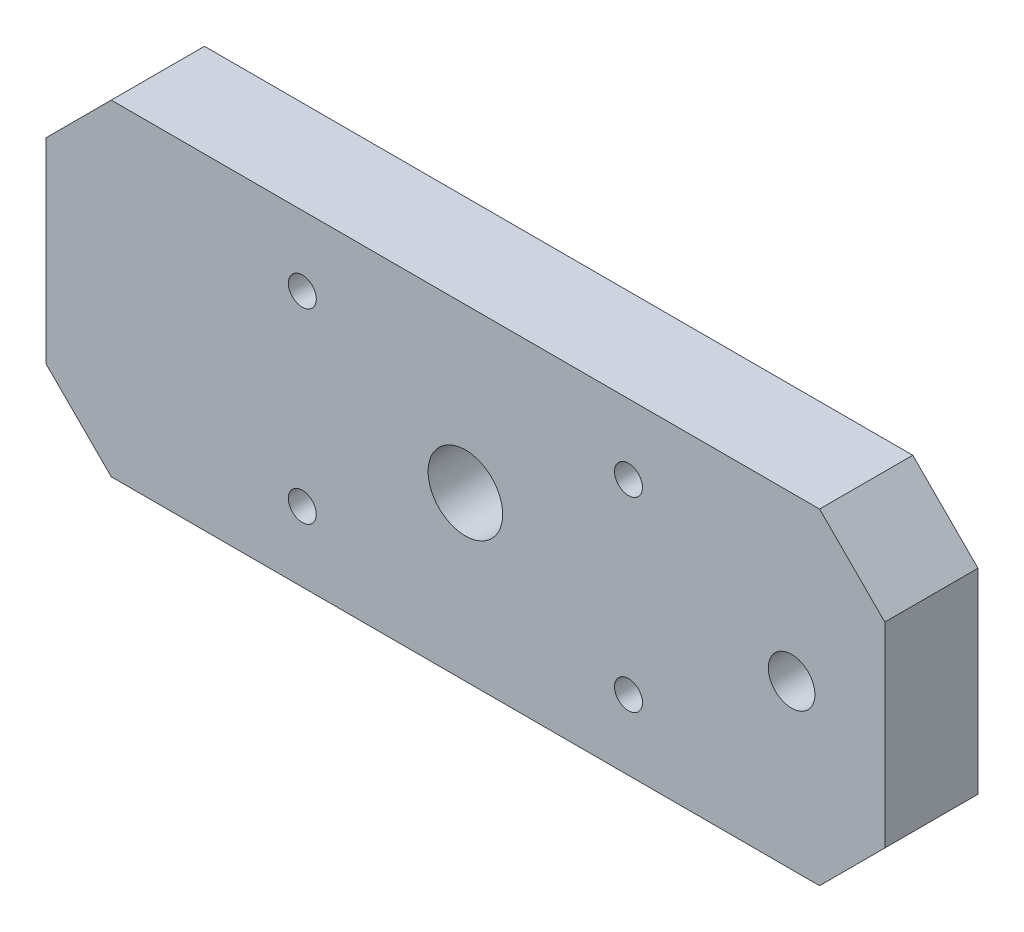
ISO-10303-21;
HEADER;
FILE_DESCRIPTION(('STEP AP214'),'2;1');
FILE_NAME('part.step','',(''),(''),'','','');
FILE_SCHEMA(('AUTOMOTIVE_DESIGN { 1 0 10303 214 1 1 1 1 }'));
ENDSEC;
DATA;
#1=APPLICATION_CONTEXT('core data for automotive mechanical design processes');
#2=APPLICATION_PROTOCOL_DEFINITION('international standard','automotive_design',2000,#1);
#3=PRODUCT_CONTEXT('',#1,'mechanical');
#4=PRODUCT('Part','Part','',(#3));
#5=PRODUCT_RELATED_PRODUCT_CATEGORY('part','',(#4));
#6=PRODUCT_DEFINITION_FORMATION('','',#4);
#7=PRODUCT_DEFINITION_CONTEXT('part definition',#1,'design');
#8=PRODUCT_DEFINITION('design','',#6,#7);
#9=PRODUCT_DEFINITION_SHAPE('','',#8);
#10=(LENGTH_UNIT() NAMED_UNIT(*) SI_UNIT(.MILLI.,.METRE.));
#11=(NAMED_UNIT(*) PLANE_ANGLE_UNIT() SI_UNIT($,.RADIAN.));
#12=(NAMED_UNIT(*) SI_UNIT($,.STERADIAN.) SOLID_ANGLE_UNIT());
#13=UNCERTAINTY_MEASURE_WITH_UNIT(LENGTH_MEASURE(1.E-05),#10,'distance_accuracy_value','');
#14=(GEOMETRIC_REPRESENTATION_CONTEXT(3) GLOBAL_UNCERTAINTY_ASSIGNED_CONTEXT((#13)) GLOBAL_UNIT_ASSIGNED_CONTEXT((#10,
#11,#12)) REPRESENTATION_CONTEXT('',''));
#15=CARTESIAN_POINT('',(0.,0.,0.));
#16=DIRECTION('',(0.,0.,1.));
#17=DIRECTION('',(1.,0.,0.));
#18=AXIS2_PLACEMENT_3D('',#15,#16,#17);
#19=CARTESIAN_POINT('',(0.,0.,10.));
#20=DIRECTION('',(0.,0.,1.));
#21=DIRECTION('',(1.,0.,0.));
#22=AXIS2_PLACEMENT_3D('',#19,#20,#21);
#23=PLANE('',#22);
#24=CARTESIAN_POINT('',(-17.5,9.99999999999999,10.));
#25=DIRECTION('',(0.,0.,1.));
#26=DIRECTION('',(-1.,0.,0.));
#27=AXIS2_PLACEMENT_3D('',#24,#25,#26);
#28=CIRCLE('',#27,1.5);
#29=CARTESIAN_POINT('',(-19.,9.99999999999999,10.));
#30=VERTEX_POINT('',#29);
#31=EDGE_CURVE('E205',#30,#30,#28,.T.);
#32=ORIENTED_EDGE('',*,*,#31,.F.);
#33=EDGE_LOOP('',(#32));
#34=FACE_BOUND('',#33,.T.);
#35=CARTESIAN_POINT('',(17.5,9.99999999999999,10.));
#36=DIRECTION('',(0.,0.,1.));
#37=DIRECTION('',(1.,0.,0.));
#38=AXIS2_PLACEMENT_3D('',#35,#36,#37);
#39=CIRCLE('',#38,1.5);
#40=CARTESIAN_POINT('',(19.,9.99999999999999,10.));
#41=VERTEX_POINT('',#40);
#42=EDGE_CURVE('E193',#41,#41,#39,.T.);
#43=ORIENTED_EDGE('',*,*,#42,.F.);
#44=EDGE_LOOP('',(#43));
#45=FACE_BOUND('',#44,.T.);
#46=CARTESIAN_POINT('',(35.,0.,10.));
#47=DIRECTION('',(0.,0.,1.));
#48=DIRECTION('',(1.,0.,0.));
#49=AXIS2_PLACEMENT_3D('',#46,#47,#48);
#50=CIRCLE('',#49,2.5);
#51=CARTESIAN_POINT('',(37.5,0.,10.));
#52=VERTEX_POINT('',#51);
#53=EDGE_CURVE('E139',#52,#52,#50,.T.);
#54=ORIENTED_EDGE('',*,*,#53,.F.);
#55=EDGE_LOOP('',(#54));
#56=FACE_BOUND('',#55,.T.);
#57=DIRECTION('',(0.,-1.,0.));
#58=VECTOR('',#57,1.);
#59=CARTESIAN_POINT('',(-45.,17.5,10.));
#60=LINE('',#59,#58);
#61=CARTESIAN_POINT('',(-45.,10.5,10.));
#62=VERTEX_POINT('',#61);
#63=CARTESIAN_POINT('',(-45.,-10.5,10.));
#64=VERTEX_POINT('',#63);
#65=EDGE_CURVE('E144',#62,#64,#60,.T.);
#66=ORIENTED_EDGE('',*,*,#65,.T.);
#67=DIRECTION('',(-0.707106781186546,0.707106781186549,0.));
#68=VECTOR('',#67,1.);
#69=CARTESIAN_POINT('',(-27.7500000000001,-27.75,10.));
#70=LINE('',#69,#68);
#71=CARTESIAN_POINT('',(-38.,-17.5,10.));
#72=VERTEX_POINT('',#71);
#73=EDGE_CURVE('E159',#64,#72,#70,.F.);
#74=ORIENTED_EDGE('',*,*,#73,.T.);
#75=DIRECTION('',(1.,0.,0.));
#76=VECTOR('',#75,1.);
#77=CARTESIAN_POINT('',(-45.,-17.5,10.));
#78=LINE('',#77,#76);
#79=CARTESIAN_POINT('',(37.9999999999999,-17.5,10.));
#80=VERTEX_POINT('',#79);
#81=EDGE_CURVE('E126',#72,#80,#78,.T.);
#82=ORIENTED_EDGE('',*,*,#81,.T.);
#83=DIRECTION('',(-0.707106781186549,-0.707106781186546,0.));
#84=VECTOR('',#83,1.);
#85=CARTESIAN_POINT('',(27.7499999999999,-27.75,10.));
#86=LINE('',#85,#84);
#87=CARTESIAN_POINT('',(45.,-10.5,10.));
#88=VERTEX_POINT('',#87);
#89=EDGE_CURVE('E157',#80,#88,#86,.F.);
#90=ORIENTED_EDGE('',*,*,#89,.T.);
#91=DIRECTION('',(0.,1.,0.));
#92=VECTOR('',#91,1.);
#93=CARTESIAN_POINT('',(45.,17.5,10.));
#94=LINE('',#93,#92);
#95=CARTESIAN_POINT('',(45.,10.5,10.));
#96=VERTEX_POINT('',#95);
#97=EDGE_CURVE('E170',#88,#96,#94,.T.);
#98=ORIENTED_EDGE('',*,*,#97,.T.);
#99=DIRECTION('',(0.707106781186546,-0.707106781186549,0.));
#100=VECTOR('',#99,1.);
#101=CARTESIAN_POINT('',(27.7500000000001,27.75,10.));
#102=LINE('',#101,#100);
#103=CARTESIAN_POINT('',(38.,17.5,10.));
#104=VERTEX_POINT('',#103);
#105=EDGE_CURVE('E61',#96,#104,#102,.F.);
#106=ORIENTED_EDGE('',*,*,#105,.T.);
#107=DIRECTION('',(-1.,0.,0.));
#108=VECTOR('',#107,1.);
#109=CARTESIAN_POINT('',(-45.,17.5,10.));
#110=LINE('',#109,#108);
#111=CARTESIAN_POINT('',(-38.,17.5,10.));
#112=VERTEX_POINT('',#111);
#113=EDGE_CURVE('E145',#104,#112,#110,.T.);
#114=ORIENTED_EDGE('',*,*,#113,.T.);
#115=DIRECTION('',(0.707106781186549,0.707106781186546,0.));
#116=VECTOR('',#115,1.);
#117=CARTESIAN_POINT('',(-27.7499999999999,27.75,10.));
#118=LINE('',#117,#116);
#119=EDGE_CURVE('E154',#112,#62,#118,.F.);
#120=ORIENTED_EDGE('',*,*,#119,.T.);
#121=EDGE_LOOP('',(#66,#74,#82,#90,#98,#106,#114,#120));
#122=FACE_BOUND('',#121,.T.);
#123=CARTESIAN_POINT('',(0.,0.,10.));
#124=DIRECTION('',(0.,0.,1.));
#125=DIRECTION('',(1.,0.,0.));
#126=AXIS2_PLACEMENT_3D('',#123,#124,#125);
#127=CIRCLE('',#126,4.);
#128=CARTESIAN_POINT('',(4.,0.,10.));
#129=VERTEX_POINT('',#128);
#130=EDGE_CURVE('E187',#129,#129,#127,.T.);
#131=ORIENTED_EDGE('',*,*,#130,.F.);
#132=EDGE_LOOP('',(#131));
#133=FACE_BOUND('',#132,.T.);
#134=CARTESIAN_POINT('',(17.5,-10.,10.));
#135=DIRECTION('',(0.,0.,1.));
#136=DIRECTION('',(-1.,0.,0.));
#137=AXIS2_PLACEMENT_3D('',#134,#135,#136);
#138=CIRCLE('',#137,1.5);
#139=CARTESIAN_POINT('',(16.,-10.,10.));
#140=VERTEX_POINT('',#139);
#141=EDGE_CURVE('E199',#140,#140,#138,.T.);
#142=ORIENTED_EDGE('',*,*,#141,.F.);
#143=EDGE_LOOP('',(#142));
#144=FACE_BOUND('',#143,.T.);
#145=CARTESIAN_POINT('',(-17.5,-10.,10.));
#146=DIRECTION('',(0.,0.,1.));
#147=DIRECTION('',(1.,0.,0.));
#148=AXIS2_PLACEMENT_3D('',#145,#146,#147);
#149=CIRCLE('',#148,1.5);
#150=CARTESIAN_POINT('',(-16.,-10.,10.));
#151=VERTEX_POINT('',#150);
#152=EDGE_CURVE('E211',#151,#151,#149,.T.);
#153=ORIENTED_EDGE('',*,*,#152,.F.);
#154=EDGE_LOOP('',(#153));
#155=FACE_BOUND('',#154,.T.);
#156=ADVANCED_FACE('F39',(#34,#45,#56,#122,#133,#144,#155),#23,.T.);
#157=CARTESIAN_POINT('',(0.,0.,0.));
#158=DIRECTION('',(0.,0.,1.));
#159=DIRECTION('',(1.,0.,0.));
#160=AXIS2_PLACEMENT_3D('',#157,#158,#159);
#161=PLANE('',#160);
#162=DIRECTION('',(1.,0.,0.));
#163=VECTOR('',#162,1.);
#164=CARTESIAN_POINT('',(-45.,-17.5,0.));
#165=LINE('',#164,#163);
#166=CARTESIAN_POINT('',(-38.,-17.5,0.));
#167=VERTEX_POINT('',#166);
#168=CARTESIAN_POINT('',(37.9999999999999,-17.5,0.));
#169=VERTEX_POINT('',#168);
#170=EDGE_CURVE('E123',#167,#169,#165,.T.);
#171=ORIENTED_EDGE('',*,*,#170,.F.);
#172=DIRECTION('',(0.707106781186546,-0.707106781186549,0.));
#173=VECTOR('',#172,1.);
#174=CARTESIAN_POINT('',(-38.,-17.5,0.));
#175=LINE('',#174,#173);
#176=CARTESIAN_POINT('',(-45.,-10.5,0.));
#177=VERTEX_POINT('',#176);
#178=EDGE_CURVE('E106',#167,#177,#175,.F.);
#179=ORIENTED_EDGE('',*,*,#178,.T.);
#180=DIRECTION('',(0.,-1.,0.));
#181=VECTOR('',#180,1.);
#182=CARTESIAN_POINT('',(-45.,17.5,0.));
#183=LINE('',#182,#181);
#184=CARTESIAN_POINT('',(-45.,10.5,0.));
#185=VERTEX_POINT('',#184);
#186=EDGE_CURVE('E134',#185,#177,#183,.T.);
#187=ORIENTED_EDGE('',*,*,#186,.F.);
#188=DIRECTION('',(-0.707106781186549,-0.707106781186546,0.));
#189=VECTOR('',#188,1.);
#190=CARTESIAN_POINT('',(-45.,10.5,0.));
#191=LINE('',#190,#189);
#192=CARTESIAN_POINT('',(-38.,17.5,0.));
#193=VERTEX_POINT('',#192);
#194=EDGE_CURVE('E127',#185,#193,#191,.F.);
#195=ORIENTED_EDGE('',*,*,#194,.T.);
#196=DIRECTION('',(-1.,0.,0.));
#197=VECTOR('',#196,1.);
#198=CARTESIAN_POINT('',(-45.,17.5,0.));
#199=LINE('',#198,#197);
#200=CARTESIAN_POINT('',(38.,17.5,0.));
#201=VERTEX_POINT('',#200);
#202=EDGE_CURVE('E137',#201,#193,#199,.T.);
#203=ORIENTED_EDGE('',*,*,#202,.F.);
#204=DIRECTION('',(-0.707106781186546,0.707106781186549,0.));
#205=VECTOR('',#204,1.);
#206=CARTESIAN_POINT('',(38.,17.5,0.));
#207=LINE('',#206,#205);
#208=CARTESIAN_POINT('',(45.,10.5,0.));
#209=VERTEX_POINT('',#208);
#210=EDGE_CURVE('E148',#201,#209,#207,.F.);
#211=ORIENTED_EDGE('',*,*,#210,.T.);
#212=DIRECTION('',(0.,1.,0.));
#213=VECTOR('',#212,1.);
#214=CARTESIAN_POINT('',(45.,17.5,0.));
#215=LINE('',#214,#213);
#216=CARTESIAN_POINT('',(45.,-10.5,0.));
#217=VERTEX_POINT('',#216);
#218=EDGE_CURVE('E133',#217,#209,#215,.T.);
#219=ORIENTED_EDGE('',*,*,#218,.F.);
#220=DIRECTION('',(0.707106781186549,0.707106781186546,0.));
#221=VECTOR('',#220,1.);
#222=CARTESIAN_POINT('',(45.,-10.5,0.));
#223=LINE('',#222,#221);
#224=EDGE_CURVE('E117',#217,#169,#223,.F.);
#225=ORIENTED_EDGE('',*,*,#224,.T.);
#226=EDGE_LOOP('',(#171,#179,#187,#195,#203,#211,#219,#225));
#227=FACE_BOUND('',#226,.T.);
#228=CARTESIAN_POINT('',(35.,0.,0.));
#229=DIRECTION('',(0.,0.,1.));
#230=DIRECTION('',(1.,0.,0.));
#231=AXIS2_PLACEMENT_3D('',#228,#229,#230);
#232=CIRCLE('',#231,2.5);
#233=CARTESIAN_POINT('',(37.5,0.,0.));
#234=VERTEX_POINT('',#233);
#235=EDGE_CURVE('E184',#234,#234,#232,.T.);
#236=ORIENTED_EDGE('',*,*,#235,.T.);
#237=EDGE_LOOP('',(#236));
#238=FACE_BOUND('',#237,.T.);
#239=CARTESIAN_POINT('',(0.,0.,0.));
#240=DIRECTION('',(0.,0.,1.));
#241=DIRECTION('',(1.,0.,0.));
#242=AXIS2_PLACEMENT_3D('',#239,#240,#241);
#243=CIRCLE('',#242,4.);
#244=CARTESIAN_POINT('',(4.,0.,0.));
#245=VERTEX_POINT('',#244);
#246=EDGE_CURVE('E190',#245,#245,#243,.T.);
#247=ORIENTED_EDGE('',*,*,#246,.T.);
#248=EDGE_LOOP('',(#247));
#249=FACE_BOUND('',#248,.T.);
#250=CARTESIAN_POINT('',(17.5,9.99999999999999,0.));
#251=DIRECTION('',(0.,0.,1.));
#252=DIRECTION('',(1.,0.,0.));
#253=AXIS2_PLACEMENT_3D('',#250,#251,#252);
#254=CIRCLE('',#253,1.5);
#255=CARTESIAN_POINT('',(19.,9.99999999999999,0.));
#256=VERTEX_POINT('',#255);
#257=EDGE_CURVE('E196',#256,#256,#254,.T.);
#258=ORIENTED_EDGE('',*,*,#257,.T.);
#259=EDGE_LOOP('',(#258));
#260=FACE_BOUND('',#259,.T.);
#261=CARTESIAN_POINT('',(17.5,-10.,0.));
#262=DIRECTION('',(0.,0.,1.));
#263=DIRECTION('',(-1.,0.,0.));
#264=AXIS2_PLACEMENT_3D('',#261,#262,#263);
#265=CIRCLE('',#264,1.5);
#266=CARTESIAN_POINT('',(16.,-10.,0.));
#267=VERTEX_POINT('',#266);
#268=EDGE_CURVE('E202',#267,#267,#265,.T.);
#269=ORIENTED_EDGE('',*,*,#268,.T.);
#270=EDGE_LOOP('',(#269));
#271=FACE_BOUND('',#270,.T.);
#272=CARTESIAN_POINT('',(-17.5,9.99999999999999,0.));
#273=DIRECTION('',(0.,0.,1.));
#274=DIRECTION('',(-1.,0.,0.));
#275=AXIS2_PLACEMENT_3D('',#272,#273,#274);
#276=CIRCLE('',#275,1.5);
#277=CARTESIAN_POINT('',(-19.,9.99999999999999,0.));
#278=VERTEX_POINT('',#277);
#279=EDGE_CURVE('E208',#278,#278,#276,.T.);
#280=ORIENTED_EDGE('',*,*,#279,.T.);
#281=EDGE_LOOP('',(#280));
#282=FACE_BOUND('',#281,.T.);
#283=CARTESIAN_POINT('',(-17.5,-10.,0.));
#284=DIRECTION('',(0.,0.,1.));
#285=DIRECTION('',(1.,0.,0.));
#286=AXIS2_PLACEMENT_3D('',#283,#284,#285);
#287=CIRCLE('',#286,1.5);
#288=CARTESIAN_POINT('',(-16.,-10.,0.));
#289=VERTEX_POINT('',#288);
#290=EDGE_CURVE('E214',#289,#289,#287,.T.);
#291=ORIENTED_EDGE('',*,*,#290,.T.);
#292=EDGE_LOOP('',(#291));
#293=FACE_BOUND('',#292,.T.);
#294=ADVANCED_FACE('F130',(#227,#238,#249,#260,#271,#282,#293),#161,.F.);
#295=CARTESIAN_POINT('',(-45.,17.5,10.));
#296=DIRECTION('',(1.,0.,0.));
#297=DIRECTION('',(0.,0.,-1.));
#298=AXIS2_PLACEMENT_3D('',#295,#296,#297);
#299=PLANE('',#298);
#300=ORIENTED_EDGE('',*,*,#186,.T.);
#301=DIRECTION('',(0.,0.,1.));
#302=VECTOR('',#301,1.);
#303=CARTESIAN_POINT('',(-45.,-10.5,10.));
#304=LINE('',#303,#302);
#305=EDGE_CURVE('E111',#177,#64,#304,.T.);
#306=ORIENTED_EDGE('',*,*,#305,.T.);
#307=ORIENTED_EDGE('',*,*,#65,.F.);
#308=DIRECTION('',(0.,0.,-1.));
#309=VECTOR('',#308,1.);
#310=CARTESIAN_POINT('',(-45.,10.5,10.));
#311=LINE('',#310,#309);
#312=EDGE_CURVE('E116',#62,#185,#311,.T.);
#313=ORIENTED_EDGE('',*,*,#312,.T.);
#314=EDGE_LOOP('',(#300,#306,#307,#313));
#315=FACE_BOUND('',#314,.T.);
#316=ADVANCED_FACE('F229',(#315),#299,.F.);
#317=CARTESIAN_POINT('',(-45.,-17.5,10.));
#318=DIRECTION('',(0.,1.,0.));
#319=DIRECTION('',(0.,0.,1.));
#320=AXIS2_PLACEMENT_3D('',#317,#318,#319);
#321=PLANE('',#320);
#322=ORIENTED_EDGE('',*,*,#81,.F.);
#323=DIRECTION('',(0.,0.,-1.));
#324=VECTOR('',#323,1.);
#325=CARTESIAN_POINT('',(-38.,-17.5,10.));
#326=LINE('',#325,#324);
#327=EDGE_CURVE('E110',#72,#167,#326,.T.);
#328=ORIENTED_EDGE('',*,*,#327,.T.);
#329=ORIENTED_EDGE('',*,*,#170,.T.);
#330=DIRECTION('',(0.,0.,1.));
#331=VECTOR('',#330,1.);
#332=CARTESIAN_POINT('',(38.,-17.5,10.));
#333=LINE('',#332,#331);
#334=EDGE_CURVE('E128',#169,#80,#333,.T.);
#335=ORIENTED_EDGE('',*,*,#334,.T.);
#336=EDGE_LOOP('',(#322,#328,#329,#335));
#337=FACE_BOUND('',#336,.T.);
#338=ADVANCED_FACE('F122',(#337),#321,.F.);
#339=CARTESIAN_POINT('',(45.,17.5,10.));
#340=DIRECTION('',(-1.,0.,0.));
#341=DIRECTION('',(0.,0.,1.));
#342=AXIS2_PLACEMENT_3D('',#339,#340,#341);
#343=PLANE('',#342);
#344=ORIENTED_EDGE('',*,*,#97,.F.);
#345=DIRECTION('',(0.,0.,-1.));
#346=VECTOR('',#345,1.);
#347=CARTESIAN_POINT('',(45.,-10.5,10.));
#348=LINE('',#347,#346);
#349=EDGE_CURVE('E163',#88,#217,#348,.T.);
#350=ORIENTED_EDGE('',*,*,#349,.T.);
#351=ORIENTED_EDGE('',*,*,#218,.T.);
#352=DIRECTION('',(0.,0.,1.));
#353=VECTOR('',#352,1.);
#354=CARTESIAN_POINT('',(45.,10.5,10.));
#355=LINE('',#354,#353);
#356=EDGE_CURVE('E161',#209,#96,#355,.T.);
#357=ORIENTED_EDGE('',*,*,#356,.T.);
#358=EDGE_LOOP('',(#344,#350,#351,#357));
#359=FACE_BOUND('',#358,.T.);
#360=ADVANCED_FACE('F168',(#359),#343,.F.);
#361=CARTESIAN_POINT('',(-45.,17.5,10.));
#362=DIRECTION('',(0.,-1.,0.));
#363=DIRECTION('',(0.,0.,-1.));
#364=AXIS2_PLACEMENT_3D('',#361,#362,#363);
#365=PLANE('',#364);
#366=ORIENTED_EDGE('',*,*,#113,.F.);
#367=DIRECTION('',(0.,0.,-1.));
#368=VECTOR('',#367,1.);
#369=CARTESIAN_POINT('',(38.,17.5,10.));
#370=LINE('',#369,#368);
#371=EDGE_CURVE('E11',#104,#201,#370,.T.);
#372=ORIENTED_EDGE('',*,*,#371,.T.);
#373=ORIENTED_EDGE('',*,*,#202,.T.);
#374=DIRECTION('',(0.,0.,1.));
#375=VECTOR('',#374,1.);
#376=CARTESIAN_POINT('',(-38.,17.5,10.));
#377=LINE('',#376,#375);
#378=EDGE_CURVE('E48',#193,#112,#377,.T.);
#379=ORIENTED_EDGE('',*,*,#378,.T.);
#380=EDGE_LOOP('',(#366,#372,#373,#379));
#381=FACE_BOUND('',#380,.T.);
#382=ADVANCED_FACE('F177',(#381),#365,.F.);
#383=CARTESIAN_POINT('',(35.,0.,10.));
#384=DIRECTION('',(0.,0.,-1.));
#385=DIRECTION('',(-1.,0.,0.));
#386=AXIS2_PLACEMENT_3D('',#383,#384,#385);
#387=CYLINDRICAL_SURFACE('',#386,2.5);
#388=ORIENTED_EDGE('',*,*,#53,.T.);
#389=EDGE_LOOP('',(#388));
#390=FACE_BOUND('',#389,.T.);
#391=ORIENTED_EDGE('',*,*,#235,.F.);
#392=EDGE_LOOP('',(#391));
#393=FACE_BOUND('',#392,.T.);
#394=ADVANCED_FACE('F234',(#390,#393),#387,.F.);
#395=CARTESIAN_POINT('',(0.,0.,10.));
#396=DIRECTION('',(0.,0.,-1.));
#397=DIRECTION('',(-1.,0.,0.));
#398=AXIS2_PLACEMENT_3D('',#395,#396,#397);
#399=CYLINDRICAL_SURFACE('',#398,4.);
#400=ORIENTED_EDGE('',*,*,#130,.T.);
#401=EDGE_LOOP('',(#400));
#402=FACE_BOUND('',#401,.T.);
#403=ORIENTED_EDGE('',*,*,#246,.F.);
#404=EDGE_LOOP('',(#403));
#405=FACE_BOUND('',#404,.T.);
#406=ADVANCED_FACE('F294',(#402,#405),#399,.F.);
#407=CARTESIAN_POINT('',(17.5,9.99999999999999,10.));
#408=DIRECTION('',(0.,0.,-1.));
#409=DIRECTION('',(-1.,0.,0.));
#410=AXIS2_PLACEMENT_3D('',#407,#408,#409);
#411=CYLINDRICAL_SURFACE('',#410,1.5);
#412=ORIENTED_EDGE('',*,*,#42,.T.);
#413=EDGE_LOOP('',(#412));
#414=FACE_BOUND('',#413,.T.);
#415=ORIENTED_EDGE('',*,*,#257,.F.);
#416=EDGE_LOOP('',(#415));
#417=FACE_BOUND('',#416,.T.);
#418=ADVANCED_FACE('F277',(#414,#417),#411,.F.);
#419=CARTESIAN_POINT('',(17.5,-10.,10.));
#420=DIRECTION('',(0.,0.,-1.));
#421=DIRECTION('',(-1.,0.,0.));
#422=AXIS2_PLACEMENT_3D('',#419,#420,#421);
#423=CYLINDRICAL_SURFACE('',#422,1.5);
#424=ORIENTED_EDGE('',*,*,#141,.T.);
#425=EDGE_LOOP('',(#424));
#426=FACE_BOUND('',#425,.T.);
#427=ORIENTED_EDGE('',*,*,#268,.F.);
#428=EDGE_LOOP('',(#427));
#429=FACE_BOUND('',#428,.T.);
#430=ADVANCED_FACE('F273',(#426,#429),#423,.F.);
#431=CARTESIAN_POINT('',(-17.5,9.99999999999999,10.));
#432=DIRECTION('',(0.,0.,-1.));
#433=DIRECTION('',(-1.,0.,0.));
#434=AXIS2_PLACEMENT_3D('',#431,#432,#433);
#435=CYLINDRICAL_SURFACE('',#434,1.5);
#436=ORIENTED_EDGE('',*,*,#31,.T.);
#437=EDGE_LOOP('',(#436));
#438=FACE_BOUND('',#437,.T.);
#439=ORIENTED_EDGE('',*,*,#279,.F.);
#440=EDGE_LOOP('',(#439));
#441=FACE_BOUND('',#440,.T.);
#442=ADVANCED_FACE('F276',(#438,#441),#435,.F.);
#443=CARTESIAN_POINT('',(-17.5,-10.,10.));
#444=DIRECTION('',(0.,0.,-1.));
#445=DIRECTION('',(-1.,0.,0.));
#446=AXIS2_PLACEMENT_3D('',#443,#444,#445);
#447=CYLINDRICAL_SURFACE('',#446,1.5);
#448=ORIENTED_EDGE('',*,*,#152,.T.);
#449=EDGE_LOOP('',(#448));
#450=FACE_BOUND('',#449,.T.);
#451=ORIENTED_EDGE('',*,*,#290,.F.);
#452=EDGE_LOOP('',(#451));
#453=FACE_BOUND('',#452,.T.);
#454=ADVANCED_FACE('F220',(#450,#453),#447,.F.);
#455=CARTESIAN_POINT('',(-38.,-17.5,10.));
#456=DIRECTION('',(0.707106781186549,0.707106781186546,0.));
#457=DIRECTION('',(0.,0.,-1.));
#458=AXIS2_PLACEMENT_3D('',#455,#456,#457);
#459=PLANE('',#458);
#460=ORIENTED_EDGE('',*,*,#73,.F.);
#461=ORIENTED_EDGE('',*,*,#305,.F.);
#462=ORIENTED_EDGE('',*,*,#178,.F.);
#463=ORIENTED_EDGE('',*,*,#327,.F.);
#464=EDGE_LOOP('',(#460,#461,#462,#463));
#465=FACE_BOUND('',#464,.T.);
#466=ADVANCED_FACE('F109',(#465),#459,.F.);
#467=CARTESIAN_POINT('',(45.,-10.5,10.));
#468=DIRECTION('',(-0.707106781186546,0.707106781186549,0.));
#469=DIRECTION('',(0.,0.,-1.));
#470=AXIS2_PLACEMENT_3D('',#467,#468,#469);
#471=PLANE('',#470);
#472=ORIENTED_EDGE('',*,*,#89,.F.);
#473=ORIENTED_EDGE('',*,*,#334,.F.);
#474=ORIENTED_EDGE('',*,*,#224,.F.);
#475=ORIENTED_EDGE('',*,*,#349,.F.);
#476=EDGE_LOOP('',(#472,#473,#474,#475));
#477=FACE_BOUND('',#476,.T.);
#478=ADVANCED_FACE('F252',(#477),#471,.F.);
#479=CARTESIAN_POINT('',(38.,17.5,10.));
#480=DIRECTION('',(-0.707106781186549,-0.707106781186546,0.));
#481=DIRECTION('',(0.,0.,-1.));
#482=AXIS2_PLACEMENT_3D('',#479,#480,#481);
#483=PLANE('',#482);
#484=ORIENTED_EDGE('',*,*,#105,.F.);
#485=ORIENTED_EDGE('',*,*,#356,.F.);
#486=ORIENTED_EDGE('',*,*,#210,.F.);
#487=ORIENTED_EDGE('',*,*,#371,.F.);
#488=EDGE_LOOP('',(#484,#485,#486,#487));
#489=FACE_BOUND('',#488,.T.);
#490=ADVANCED_FACE('F176',(#489),#483,.F.);
#491=CARTESIAN_POINT('',(-45.,10.5,10.));
#492=DIRECTION('',(0.707106781186546,-0.707106781186549,0.));
#493=DIRECTION('',(0.,0.,-1.));
#494=AXIS2_PLACEMENT_3D('',#491,#492,#493);
#495=PLANE('',#494);
#496=ORIENTED_EDGE('',*,*,#119,.F.);
#497=ORIENTED_EDGE('',*,*,#378,.F.);
#498=ORIENTED_EDGE('',*,*,#194,.F.);
#499=ORIENTED_EDGE('',*,*,#312,.F.);
#500=EDGE_LOOP('',(#496,#497,#498,#499));
#501=FACE_BOUND('',#500,.T.);
#502=ADVANCED_FACE('F42',(#501),#495,.F.);
#503=CLOSED_SHELL('',(#156,#294,#316,#338,#360,#382,#394,#406,#418,#430,#442,#454,#466,#478,
#490,#502));
#504=MANIFOLD_SOLID_BREP('B2',#503);
#505=ADVANCED_BREP_SHAPE_REPRESENTATION('',(#18,#504),#14);
#506=SHAPE_DEFINITION_REPRESENTATION(#9,#505);
ENDSEC;
END-ISO-10303-21;
